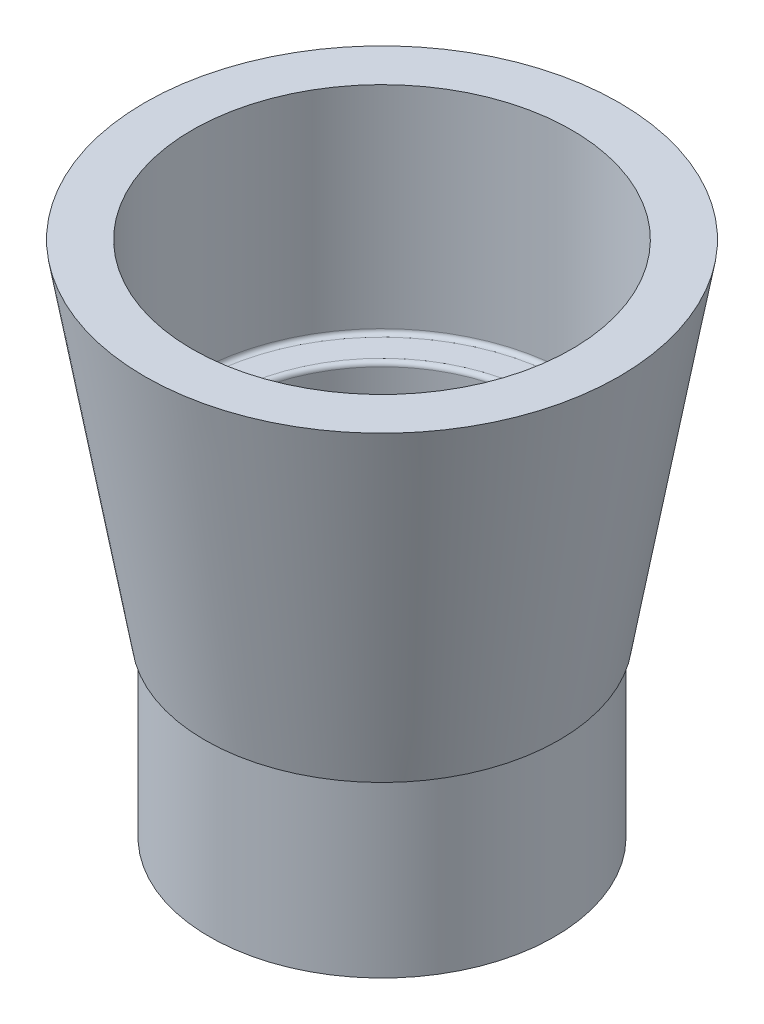
ISO-10303-21;
HEADER;
FILE_DESCRIPTION(('STEP AP214'),'2;1');
FILE_NAME('part.step','',(''),(''),'','','');
FILE_SCHEMA(('AUTOMOTIVE_DESIGN { 1 0 10303 214 1 1 1 1 }'));
ENDSEC;
DATA;
#1=APPLICATION_CONTEXT('core data for automotive mechanical design processes');
#2=APPLICATION_PROTOCOL_DEFINITION('international standard','automotive_design',2000,#1);
#3=PRODUCT_CONTEXT('',#1,'mechanical');
#4=PRODUCT('Part','Part','',(#3));
#5=PRODUCT_RELATED_PRODUCT_CATEGORY('part','',(#4));
#6=PRODUCT_DEFINITION_FORMATION('','',#4);
#7=PRODUCT_DEFINITION_CONTEXT('part definition',#1,'design');
#8=PRODUCT_DEFINITION('design','',#6,#7);
#9=PRODUCT_DEFINITION_SHAPE('','',#8);
#10=(LENGTH_UNIT() NAMED_UNIT(*) SI_UNIT(.MILLI.,.METRE.));
#11=(NAMED_UNIT(*) PLANE_ANGLE_UNIT() SI_UNIT($,.RADIAN.));
#12=(NAMED_UNIT(*) SI_UNIT($,.STERADIAN.) SOLID_ANGLE_UNIT());
#13=UNCERTAINTY_MEASURE_WITH_UNIT(LENGTH_MEASURE(1.E-05),#10,'distance_accuracy_value','');
#14=(GEOMETRIC_REPRESENTATION_CONTEXT(3) GLOBAL_UNCERTAINTY_ASSIGNED_CONTEXT((#13)) GLOBAL_UNIT_ASSIGNED_CONTEXT((#10,
#11,#12)) REPRESENTATION_CONTEXT('',''));
#15=CARTESIAN_POINT('',(0.,0.,0.));
#16=DIRECTION('',(0.,0.,1.));
#17=DIRECTION('',(1.,0.,0.));
#18=AXIS2_PLACEMENT_3D('',#15,#16,#17);
#19=CARTESIAN_POINT('',(0.,50.8,0.));
#20=DIRECTION('',(0.,-1.,0.));
#21=DIRECTION('',(0.,0.,-1.));
#22=AXIS2_PLACEMENT_3D('',#19,#20,#21);
#23=CYLINDRICAL_SURFACE('',#22,22.86);
#24=CARTESIAN_POINT('',(0.,18.415,0.));
#25=DIRECTION('',(0.,1.,0.));
#26=DIRECTION('',(0.,0.,1.));
#27=AXIS2_PLACEMENT_3D('',#24,#25,#26);
#28=CIRCLE('',#27,22.86);
#29=CARTESIAN_POINT('',(0.,18.415,22.86));
#30=VERTEX_POINT('',#29);
#31=EDGE_CURVE('E46',#30,#30,#28,.T.);
#32=ORIENTED_EDGE('',*,*,#31,.T.);
#33=EDGE_LOOP('',(#32));
#34=FACE_BOUND('',#33,.T.);
#35=CARTESIAN_POINT('',(0.,-25.4,0.));
#36=DIRECTION('',(0.,-1.,0.));
#37=DIRECTION('',(0.,0.,-1.));
#38=AXIS2_PLACEMENT_3D('',#35,#36,#37);
#39=CIRCLE('',#38,22.86);
#40=CARTESIAN_POINT('',(0.,-25.4,-22.86));
#41=VERTEX_POINT('',#40);
#42=EDGE_CURVE('E71',#41,#41,#39,.T.);
#43=ORIENTED_EDGE('',*,*,#42,.T.);
#44=EDGE_LOOP('',(#43));
#45=FACE_BOUND('',#44,.T.);
#46=ADVANCED_FACE('F39',(#34,#45),#23,.F.);
#47=CARTESIAN_POINT('',(-26.0604,0.,0.));
#48=DIRECTION('',(0.,1.,0.));
#49=DIRECTION('',(0.,0.,1.));
#50=AXIS2_PLACEMENT_3D('',#47,#48,#49);
#51=PLANE('',#50);
#52=CARTESIAN_POINT('',(0.,0.,0.));
#53=DIRECTION('',(0.,-1.,0.));
#54=DIRECTION('',(0.,0.,-1.));
#55=AXIS2_PLACEMENT_3D('',#52,#53,#54);
#56=CIRCLE('',#55,25.4);
#57=CARTESIAN_POINT('',(0.,0.,-25.4));
#58=VERTEX_POINT('',#57);
#59=EDGE_CURVE('E59',#58,#58,#56,.T.);
#60=ORIENTED_EDGE('',*,*,#59,.F.);
#61=EDGE_LOOP('',(#60));
#62=FACE_BOUND('',#61,.T.);
#63=CARTESIAN_POINT('',(0.,0.,0.));
#64=DIRECTION('',(0.,-1.,0.));
#65=DIRECTION('',(0.,0.,-1.));
#66=AXIS2_PLACEMENT_3D('',#63,#64,#65);
#67=CIRCLE('',#66,26.0604);
#68=CARTESIAN_POINT('',(0.,0.,-26.0604));
#69=VERTEX_POINT('',#68);
#70=EDGE_CURVE('E63',#69,#69,#67,.T.);
#71=ORIENTED_EDGE('',*,*,#70,.T.);
#72=EDGE_LOOP('',(#71));
#73=FACE_BOUND('',#72,.T.);
#74=ADVANCED_FACE('F84',(#62,#73),#51,.F.);
#75=CARTESIAN_POINT('',(0.,50.8,0.));
#76=DIRECTION('',(0.,-1.,0.));
#77=DIRECTION('',(0.,0.,-1.));
#78=AXIS2_PLACEMENT_3D('',#75,#76,#77);
#79=PLANE('',#78);
#80=CARTESIAN_POINT('',(0.,50.8,0.));
#81=DIRECTION('',(0.,1.,0.));
#82=DIRECTION('',(0.,0.,1.));
#83=AXIS2_PLACEMENT_3D('',#80,#81,#82);
#84=CIRCLE('',#83,27.94);
#85=CARTESIAN_POINT('',(0.,50.8,27.94));
#86=VERTEX_POINT('',#85);
#87=EDGE_CURVE('E74',#86,#86,#84,.T.);
#88=ORIENTED_EDGE('',*,*,#87,.F.);
#89=EDGE_LOOP('',(#88));
#90=FACE_BOUND('',#89,.T.);
#91=CARTESIAN_POINT('',(0.,50.8,0.));
#92=DIRECTION('',(0.,-1.,0.));
#93=DIRECTION('',(0.,0.,-1.));
#94=AXIS2_PLACEMENT_3D('',#91,#92,#93);
#95=CIRCLE('',#94,34.925);
#96=CARTESIAN_POINT('',(0.,50.8,-34.925));
#97=VERTEX_POINT('',#96);
#98=EDGE_CURVE('E60',#97,#97,#95,.T.);
#99=ORIENTED_EDGE('',*,*,#98,.F.);
#100=EDGE_LOOP('',(#99));
#101=FACE_BOUND('',#100,.T.);
#102=ADVANCED_FACE('F80',(#90,#101),#79,.F.);
#103=CARTESIAN_POINT('',(0.,50.8,0.));
#104=DIRECTION('',(0.,1.,0.));
#105=DIRECTION('',(0.,0.,1.));
#106=AXIS2_PLACEMENT_3D('',#103,#104,#105);
#107=CONICAL_SURFACE('',#106,34.925,0.172760482787757);
#108=ORIENTED_EDGE('',*,*,#70,.F.);
#109=EDGE_LOOP('',(#108));
#110=FACE_BOUND('',#109,.T.);
#111=ORIENTED_EDGE('',*,*,#98,.T.);
#112=EDGE_LOOP('',(#111));
#113=FACE_BOUND('',#112,.T.);
#114=ADVANCED_FACE('F83',(#110,#113),#107,.T.);
#115=CARTESIAN_POINT('',(0.,-25.4,0.));
#116=DIRECTION('',(0.,1.,0.));
#117=DIRECTION('',(0.,0.,1.));
#118=AXIS2_PLACEMENT_3D('',#115,#116,#117);
#119=CYLINDRICAL_SURFACE('',#118,25.4);
#120=CARTESIAN_POINT('',(0.,-25.4,0.));
#121=DIRECTION('',(0.,-1.,0.));
#122=DIRECTION('',(0.,0.,-1.));
#123=AXIS2_PLACEMENT_3D('',#120,#121,#122);
#124=CIRCLE('',#123,25.4);
#125=CARTESIAN_POINT('',(0.,-25.4,-25.4));
#126=VERTEX_POINT('',#125);
#127=EDGE_CURVE('E66',#126,#126,#124,.T.);
#128=ORIENTED_EDGE('',*,*,#127,.F.);
#129=EDGE_LOOP('',(#128));
#130=FACE_BOUND('',#129,.T.);
#131=ORIENTED_EDGE('',*,*,#59,.T.);
#132=EDGE_LOOP('',(#131));
#133=FACE_BOUND('',#132,.T.);
#134=ADVANCED_FACE('F89',(#130,#133),#119,.T.);
#135=CARTESIAN_POINT('',(0.,-25.4,0.));
#136=DIRECTION('',(0.,-1.,0.));
#137=DIRECTION('',(0.,0.,-1.));
#138=AXIS2_PLACEMENT_3D('',#135,#136,#137);
#139=PLANE('',#138);
#140=ORIENTED_EDGE('',*,*,#42,.F.);
#141=EDGE_LOOP('',(#140));
#142=FACE_BOUND('',#141,.T.);
#143=ORIENTED_EDGE('',*,*,#127,.T.);
#144=EDGE_LOOP('',(#143));
#145=FACE_BOUND('',#144,.T.);
#146=ADVANCED_FACE('F96',(#142,#145),#139,.T.);
#147=CARTESIAN_POINT('',(0.,19.05,0.));
#148=DIRECTION('',(0.,1.,0.));
#149=DIRECTION('',(0.,0.,1.));
#150=AXIS2_PLACEMENT_3D('',#147,#148,#149);
#151=PLANE('',#150);
#152=CARTESIAN_POINT('',(0.,19.05,0.));
#153=DIRECTION('',(0.,1.,0.));
#154=DIRECTION('',(0.,0.,1.));
#155=AXIS2_PLACEMENT_3D('',#152,#153,#154);
#156=CIRCLE('',#155,23.495);
#157=CARTESIAN_POINT('',(0.,19.05,23.495));
#158=VERTEX_POINT('',#157);
#159=EDGE_CURVE('E50',#158,#158,#156,.F.);
#160=ORIENTED_EDGE('',*,*,#159,.T.);
#161=EDGE_LOOP('',(#160));
#162=FACE_BOUND('',#161,.T.);
#163=CARTESIAN_POINT('',(0.,19.05,0.));
#164=DIRECTION('',(0.,1.,0.));
#165=DIRECTION('',(0.,0.,1.));
#166=AXIS2_PLACEMENT_3D('',#163,#164,#165);
#167=CIRCLE('',#166,27.305);
#168=CARTESIAN_POINT('',(0.,19.05,27.305));
#169=VERTEX_POINT('',#168);
#170=EDGE_CURVE('E54',#169,#169,#167,.T.);
#171=ORIENTED_EDGE('',*,*,#170,.T.);
#172=EDGE_LOOP('',(#171));
#173=FACE_BOUND('',#172,.T.);
#174=ADVANCED_FACE('F112',(#162,#173),#151,.T.);
#175=CARTESIAN_POINT('',(0.,19.05,0.));
#176=DIRECTION('',(0.,1.,0.));
#177=DIRECTION('',(0.,0.,1.));
#178=AXIS2_PLACEMENT_3D('',#175,#176,#177);
#179=CYLINDRICAL_SURFACE('',#178,27.94);
#180=CARTESIAN_POINT('',(0.,19.685,0.));
#181=DIRECTION('',(0.,1.,0.));
#182=DIRECTION('',(0.,0.,1.));
#183=AXIS2_PLACEMENT_3D('',#180,#181,#182);
#184=CIRCLE('',#183,27.94);
#185=CARTESIAN_POINT('',(0.,19.685,27.94));
#186=VERTEX_POINT('',#185);
#187=EDGE_CURVE('E10',#186,#186,#184,.F.);
#188=ORIENTED_EDGE('',*,*,#187,.T.);
#189=EDGE_LOOP('',(#188));
#190=FACE_BOUND('',#189,.T.);
#191=ORIENTED_EDGE('',*,*,#87,.T.);
#192=EDGE_LOOP('',(#191));
#193=FACE_BOUND('',#192,.T.);
#194=ADVANCED_FACE('F78',(#190,#193),#179,.F.);
#195=CARTESIAN_POINT('',(0.,18.415,0.));
#196=DIRECTION('',(0.,1.,0.));
#197=DIRECTION('',(0.,0.,1.));
#198=AXIS2_PLACEMENT_3D('',#195,#196,#197);
#199=TOROIDAL_SURFACE('',#198,23.495,0.635);
#200=ORIENTED_EDGE('',*,*,#31,.F.);
#201=EDGE_LOOP('',(#200));
#202=FACE_BOUND('',#201,.T.);
#203=ORIENTED_EDGE('',*,*,#159,.F.);
#204=EDGE_LOOP('',(#203));
#205=FACE_BOUND('',#204,.T.);
#206=ADVANCED_FACE('F126',(#202,#205),#199,.T.);
#207=CARTESIAN_POINT('',(0.,19.685,0.));
#208=DIRECTION('',(0.,1.,0.));
#209=DIRECTION('',(0.,0.,1.));
#210=AXIS2_PLACEMENT_3D('',#207,#208,#209);
#211=TOROIDAL_SURFACE('',#210,27.305,0.635);
#212=ORIENTED_EDGE('',*,*,#187,.F.);
#213=EDGE_LOOP('',(#212));
#214=FACE_BOUND('',#213,.T.);
#215=ORIENTED_EDGE('',*,*,#170,.F.);
#216=EDGE_LOOP('',(#215));
#217=FACE_BOUND('',#216,.T.);
#218=ADVANCED_FACE('F41',(#214,#217),#211,.F.);
#219=CLOSED_SHELL('',(#46,#74,#102,#114,#134,#146,#174,#194,#206,#218));
#220=MANIFOLD_SOLID_BREP('B2',#219);
#221=ADVANCED_BREP_SHAPE_REPRESENTATION('',(#18,#220),#14);
#222=SHAPE_DEFINITION_REPRESENTATION(#9,#221);
ENDSEC;
END-ISO-10303-21;
